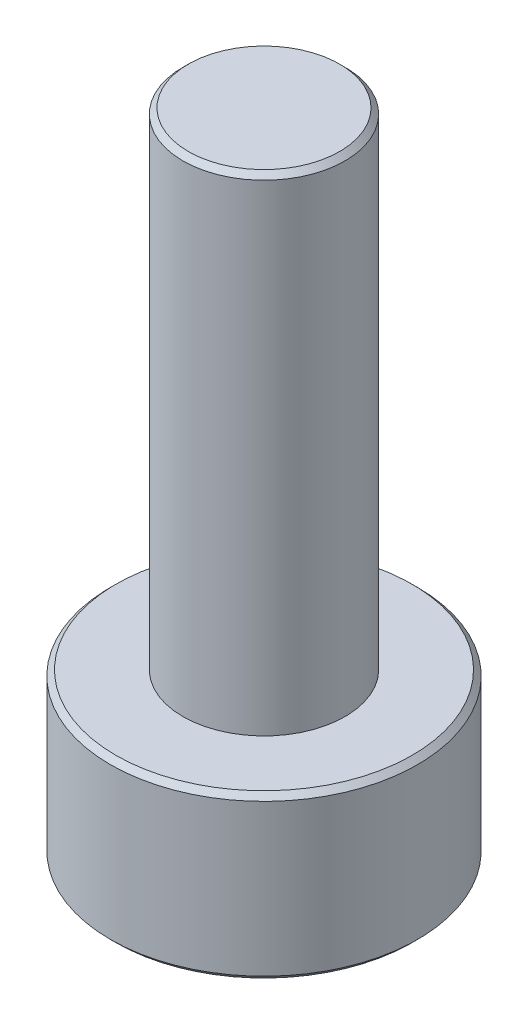
ISO-10303-21;
HEADER;
FILE_DESCRIPTION(('STEP AP214'),'2;1');
FILE_NAME('part.step','',(''),(''),'','','');
FILE_SCHEMA(('AUTOMOTIVE_DESIGN { 1 0 10303 214 1 1 1 1 }'));
ENDSEC;
DATA;
#1=APPLICATION_CONTEXT('core data for automotive mechanical design processes');
#2=APPLICATION_PROTOCOL_DEFINITION('international standard','automotive_design',2000,#1);
#3=PRODUCT_CONTEXT('',#1,'mechanical');
#4=PRODUCT('Part','Part','',(#3));
#5=PRODUCT_RELATED_PRODUCT_CATEGORY('part','',(#4));
#6=PRODUCT_DEFINITION_FORMATION('','',#4);
#7=PRODUCT_DEFINITION_CONTEXT('part definition',#1,'design');
#8=PRODUCT_DEFINITION('design','',#6,#7);
#9=PRODUCT_DEFINITION_SHAPE('','',#8);
#10=(LENGTH_UNIT() NAMED_UNIT(*) SI_UNIT(.MILLI.,.METRE.));
#11=(NAMED_UNIT(*) PLANE_ANGLE_UNIT() SI_UNIT($,.RADIAN.));
#12=(NAMED_UNIT(*) SI_UNIT($,.STERADIAN.) SOLID_ANGLE_UNIT());
#13=UNCERTAINTY_MEASURE_WITH_UNIT(LENGTH_MEASURE(1.E-05),#10,'distance_accuracy_value','');
#14=(GEOMETRIC_REPRESENTATION_CONTEXT(3) GLOBAL_UNCERTAINTY_ASSIGNED_CONTEXT((#13)) GLOBAL_UNIT_ASSIGNED_CONTEXT((#10,
#11,#12)) REPRESENTATION_CONTEXT('',''));
#15=CARTESIAN_POINT('',(0.,0.,0.));
#16=DIRECTION('',(0.,0.,1.));
#17=DIRECTION('',(1.,0.,0.));
#18=AXIS2_PLACEMENT_3D('',#15,#16,#17);
#19=CARTESIAN_POINT('',(0.,3.,0.));
#20=DIRECTION('',(0.,-1.,0.));
#21=DIRECTION('',(0.,0.,-1.));
#22=AXIS2_PLACEMENT_3D('',#19,#20,#21);
#23=CYLINDRICAL_SURFACE('',#22,2.84);
#24=CARTESIAN_POINT('',(0.,2.9,0.));
#25=DIRECTION('',(0.,1.,0.));
#26=DIRECTION('',(0.,0.,1.));
#27=AXIS2_PLACEMENT_3D('',#24,#25,#26);
#28=CIRCLE('',#27,2.84);
#29=CARTESIAN_POINT('',(0.,2.9,2.84));
#30=VERTEX_POINT('',#29);
#31=EDGE_CURVE('E43',#30,#30,#28,.F.);
#32=ORIENTED_EDGE('',*,*,#31,.T.);
#33=EDGE_LOOP('',(#32));
#34=FACE_BOUND('',#33,.T.);
#35=CARTESIAN_POINT('',(0.,0.100000000000002,0.));
#36=DIRECTION('',(0.,1.,0.));
#37=DIRECTION('',(0.,0.,1.));
#38=AXIS2_PLACEMENT_3D('',#35,#36,#37);
#39=CIRCLE('',#38,2.84);
#40=CARTESIAN_POINT('',(0.,0.100000000000002,2.84));
#41=VERTEX_POINT('',#40);
#42=EDGE_CURVE('E154',#41,#41,#39,.T.);
#43=ORIENTED_EDGE('',*,*,#42,.T.);
#44=EDGE_LOOP('',(#43));
#45=FACE_BOUND('',#44,.T.);
#46=ADVANCED_FACE('F35',(#34,#45),#23,.T.);
#47=CARTESIAN_POINT('',(0.,3.,0.));
#48=DIRECTION('',(0.,1.,0.));
#49=DIRECTION('',(0.,0.,1.));
#50=AXIS2_PLACEMENT_3D('',#47,#48,#49);
#51=PLANE('',#50);
#52=CARTESIAN_POINT('',(0.,3.,0.));
#53=DIRECTION('',(0.,1.,0.));
#54=DIRECTION('',(0.,0.,1.));
#55=AXIS2_PLACEMENT_3D('',#52,#53,#54);
#56=CIRCLE('',#55,2.74);
#57=CARTESIAN_POINT('',(0.,3.,2.74));
#58=VERTEX_POINT('',#57);
#59=EDGE_CURVE('E151',#58,#58,#56,.T.);
#60=ORIENTED_EDGE('',*,*,#59,.T.);
#61=EDGE_LOOP('',(#60));
#62=FACE_BOUND('',#61,.T.);
#63=CARTESIAN_POINT('',(0.,3.,0.));
#64=DIRECTION('',(0.,1.,0.));
#65=DIRECTION('',(0.,0.,1.));
#66=AXIS2_PLACEMENT_3D('',#63,#64,#65);
#67=CIRCLE('',#66,1.5);
#68=CARTESIAN_POINT('',(0.,3.,1.5));
#69=VERTEX_POINT('',#68);
#70=EDGE_CURVE('E137',#69,#69,#67,.T.);
#71=ORIENTED_EDGE('',*,*,#70,.F.);
#72=EDGE_LOOP('',(#71));
#73=FACE_BOUND('',#72,.T.);
#74=ADVANCED_FACE('F167',(#62,#73),#51,.T.);
#75=CARTESIAN_POINT('',(0.,0.,0.));
#76=DIRECTION('',(0.,1.,0.));
#77=DIRECTION('',(0.,0.,1.));
#78=AXIS2_PLACEMENT_3D('',#75,#76,#77);
#79=PLANE('',#78);
#80=CARTESIAN_POINT('',(0.,0.,0.));
#81=DIRECTION('',(0.,1.,0.));
#82=DIRECTION('',(0.,0.,1.));
#83=AXIS2_PLACEMENT_3D('',#80,#81,#82);
#84=CIRCLE('',#83,2.74);
#85=CARTESIAN_POINT('',(0.,0.,2.74));
#86=VERTEX_POINT('',#85);
#87=EDGE_CURVE('E11',#86,#86,#84,.F.);
#88=ORIENTED_EDGE('',*,*,#87,.T.);
#89=EDGE_LOOP('',(#88));
#90=FACE_BOUND('',#89,.T.);
#91=DIRECTION('',(0.,0.,1.));
#92=VECTOR('',#91,1.);
#93=CARTESIAN_POINT('',(1.29,0.,-0.744781847254618));
#94=LINE('',#93,#92);
#95=CARTESIAN_POINT('',(1.29,0.,-0.744781847254618));
#96=VERTEX_POINT('',#95);
#97=CARTESIAN_POINT('',(1.29,0.,0.744781847254619));
#98=VERTEX_POINT('',#97);
#99=EDGE_CURVE('E124',#96,#98,#94,.T.);
#100=ORIENTED_EDGE('',*,*,#99,.F.);
#101=DIRECTION('',(0.866025403784439,0.,0.5));
#102=VECTOR('',#101,1.);
#103=CARTESIAN_POINT('',(0.,0.,-1.48956369450924));
#104=LINE('',#103,#102);
#105=CARTESIAN_POINT('',(0.,0.,-1.48956369450924));
#106=VERTEX_POINT('',#105);
#107=EDGE_CURVE('E50',#106,#96,#104,.T.);
#108=ORIENTED_EDGE('',*,*,#107,.F.);
#109=DIRECTION('',(0.866025403784439,0.,-0.5));
#110=VECTOR('',#109,1.);
#111=CARTESIAN_POINT('',(-1.29,0.,-0.744781847254618));
#112=LINE('',#111,#110);
#113=CARTESIAN_POINT('',(-1.29,0.,-0.744781847254618));
#114=VERTEX_POINT('',#113);
#115=EDGE_CURVE('E133',#114,#106,#112,.T.);
#116=ORIENTED_EDGE('',*,*,#115,.F.);
#117=DIRECTION('',(0.,0.,-1.));
#118=VECTOR('',#117,1.);
#119=CARTESIAN_POINT('',(-1.29,0.,0.744781847254619));
#120=LINE('',#119,#118);
#121=CARTESIAN_POINT('',(-1.29,0.,0.744781847254619));
#122=VERTEX_POINT('',#121);
#123=EDGE_CURVE('E131',#122,#114,#120,.T.);
#124=ORIENTED_EDGE('',*,*,#123,.F.);
#125=DIRECTION('',(-0.866025403784439,0.,-0.5));
#126=VECTOR('',#125,1.);
#127=CARTESIAN_POINT('',(0.,0.,1.48956369450924));
#128=LINE('',#127,#126);
#129=CARTESIAN_POINT('',(0.,0.,1.48956369450924));
#130=VERTEX_POINT('',#129);
#131=EDGE_CURVE('E98',#130,#122,#128,.T.);
#132=ORIENTED_EDGE('',*,*,#131,.F.);
#133=DIRECTION('',(-0.866025403784439,0.,0.5));
#134=VECTOR('',#133,1.);
#135=CARTESIAN_POINT('',(1.29,0.,0.744781847254619));
#136=LINE('',#135,#134);
#137=EDGE_CURVE('E127',#98,#130,#136,.T.);
#138=ORIENTED_EDGE('',*,*,#137,.F.);
#139=EDGE_LOOP('',(#100,#108,#116,#124,#132,#138));
#140=FACE_BOUND('',#139,.T.);
#141=ADVANCED_FACE('F170',(#90,#140),#79,.F.);
#142=CARTESIAN_POINT('',(0.,12.,0.));
#143=DIRECTION('',(0.,-1.,0.));
#144=DIRECTION('',(0.,0.,-1.));
#145=AXIS2_PLACEMENT_3D('',#142,#143,#144);
#146=CYLINDRICAL_SURFACE('',#145,1.5);
#147=CARTESIAN_POINT('',(0.,11.9,0.));
#148=DIRECTION('',(0.,1.,0.));
#149=DIRECTION('',(0.,0.,1.));
#150=AXIS2_PLACEMENT_3D('',#147,#148,#149);
#151=CIRCLE('',#150,1.5);
#152=CARTESIAN_POINT('',(0.,11.9,1.5));
#153=VERTEX_POINT('',#152);
#154=EDGE_CURVE('E148',#153,#153,#151,.F.);
#155=ORIENTED_EDGE('',*,*,#154,.T.);
#156=EDGE_LOOP('',(#155));
#157=FACE_BOUND('',#156,.T.);
#158=ORIENTED_EDGE('',*,*,#70,.T.);
#159=EDGE_LOOP('',(#158));
#160=FACE_BOUND('',#159,.T.);
#161=ADVANCED_FACE('F174',(#157,#160),#146,.T.);
#162=CARTESIAN_POINT('',(0.,12.,0.));
#163=DIRECTION('',(0.,1.,0.));
#164=DIRECTION('',(0.,0.,1.));
#165=AXIS2_PLACEMENT_3D('',#162,#163,#164);
#166=PLANE('',#165);
#167=CARTESIAN_POINT('',(0.,12.,0.));
#168=DIRECTION('',(0.,1.,0.));
#169=DIRECTION('',(0.,0.,1.));
#170=AXIS2_PLACEMENT_3D('',#167,#168,#169);
#171=CIRCLE('',#170,1.4);
#172=CARTESIAN_POINT('',(0.,12.,1.4));
#173=VERTEX_POINT('',#172);
#174=EDGE_CURVE('E145',#173,#173,#171,.T.);
#175=ORIENTED_EDGE('',*,*,#174,.T.);
#176=EDGE_LOOP('',(#175));
#177=FACE_BOUND('',#176,.T.);
#178=ADVANCED_FACE('F176',(#177),#166,.T.);
#179=CARTESIAN_POINT('',(0.,1.3,-1.48956369450924));
#180=DIRECTION('',(0.5,0.,-0.866025403784439));
#181=DIRECTION('',(-0.866025403784439,0.,-0.5));
#182=AXIS2_PLACEMENT_3D('',#179,#180,#181);
#183=PLANE('',#182);
#184=ORIENTED_EDGE('',*,*,#107,.T.);
#185=DIRECTION('',(0.,-1.,0.));
#186=VECTOR('',#185,1.);
#187=CARTESIAN_POINT('',(1.29,1.3,-0.744781847254618));
#188=LINE('',#187,#186);
#189=CARTESIAN_POINT('',(1.29,1.3,-0.744781847254618));
#190=VERTEX_POINT('',#189);
#191=EDGE_CURVE('E80',#190,#96,#188,.T.);
#192=ORIENTED_EDGE('',*,*,#191,.F.);
#193=DIRECTION('',(0.866025403784439,0.,0.5));
#194=VECTOR('',#193,1.);
#195=CARTESIAN_POINT('',(0.,1.3,-1.48956369450924));
#196=LINE('',#195,#194);
#197=CARTESIAN_POINT('',(0.,1.3,-1.48956369450924));
#198=VERTEX_POINT('',#197);
#199=EDGE_CURVE('E135',#198,#190,#196,.T.);
#200=ORIENTED_EDGE('',*,*,#199,.F.);
#201=DIRECTION('',(0.,-1.,0.));
#202=VECTOR('',#201,1.);
#203=CARTESIAN_POINT('',(0.,1.3,-1.48956369450924));
#204=LINE('',#203,#202);
#205=EDGE_CURVE('E58',#198,#106,#204,.T.);
#206=ORIENTED_EDGE('',*,*,#205,.T.);
#207=EDGE_LOOP('',(#184,#192,#200,#206));
#208=FACE_BOUND('',#207,.T.);
#209=ADVANCED_FACE('F183',(#208),#183,.F.);
#210=CARTESIAN_POINT('',(-1.29,1.3,-0.744781847254618));
#211=DIRECTION('',(-0.5,0.,-0.866025403784439));
#212=DIRECTION('',(-0.866025403784439,0.,0.5));
#213=AXIS2_PLACEMENT_3D('',#210,#211,#212);
#214=PLANE('',#213);
#215=ORIENTED_EDGE('',*,*,#115,.T.);
#216=ORIENTED_EDGE('',*,*,#205,.F.);
#217=DIRECTION('',(0.866025403784439,0.,-0.5));
#218=VECTOR('',#217,1.);
#219=CARTESIAN_POINT('',(-1.29,1.3,-0.744781847254618));
#220=LINE('',#219,#218);
#221=CARTESIAN_POINT('',(-1.29,1.3,-0.744781847254618));
#222=VERTEX_POINT('',#221);
#223=EDGE_CURVE('E110',#222,#198,#220,.T.);
#224=ORIENTED_EDGE('',*,*,#223,.F.);
#225=DIRECTION('',(0.,-1.,0.));
#226=VECTOR('',#225,1.);
#227=CARTESIAN_POINT('',(-1.29,1.3,-0.744781847254618));
#228=LINE('',#227,#226);
#229=EDGE_CURVE('E102',#222,#114,#228,.T.);
#230=ORIENTED_EDGE('',*,*,#229,.T.);
#231=EDGE_LOOP('',(#215,#216,#224,#230));
#232=FACE_BOUND('',#231,.T.);
#233=ADVANCED_FACE('F210',(#232),#214,.F.);
#234=CARTESIAN_POINT('',(-1.29,1.3,0.744781847254619));
#235=DIRECTION('',(-1.,0.,0.));
#236=DIRECTION('',(0.,0.,1.));
#237=AXIS2_PLACEMENT_3D('',#234,#235,#236);
#238=PLANE('',#237);
#239=ORIENTED_EDGE('',*,*,#123,.T.);
#240=ORIENTED_EDGE('',*,*,#229,.F.);
#241=DIRECTION('',(0.,0.,-1.));
#242=VECTOR('',#241,1.);
#243=CARTESIAN_POINT('',(-1.29,1.3,0.744781847254619));
#244=LINE('',#243,#242);
#245=CARTESIAN_POINT('',(-1.29,1.3,0.744781847254619));
#246=VERTEX_POINT('',#245);
#247=EDGE_CURVE('E106',#246,#222,#244,.T.);
#248=ORIENTED_EDGE('',*,*,#247,.F.);
#249=DIRECTION('',(0.,-1.,0.));
#250=VECTOR('',#249,1.);
#251=CARTESIAN_POINT('',(-1.29,1.3,0.744781847254619));
#252=LINE('',#251,#250);
#253=EDGE_CURVE('E91',#246,#122,#252,.T.);
#254=ORIENTED_EDGE('',*,*,#253,.T.);
#255=EDGE_LOOP('',(#239,#240,#248,#254));
#256=FACE_BOUND('',#255,.T.);
#257=ADVANCED_FACE('F107',(#256),#238,.F.);
#258=CARTESIAN_POINT('',(0.,1.3,1.48956369450924));
#259=DIRECTION('',(-0.5,0.,0.866025403784439));
#260=DIRECTION('',(0.866025403784439,0.,0.5));
#261=AXIS2_PLACEMENT_3D('',#258,#259,#260);
#262=PLANE('',#261);
#263=ORIENTED_EDGE('',*,*,#131,.T.);
#264=ORIENTED_EDGE('',*,*,#253,.F.);
#265=DIRECTION('',(-0.866025403784439,0.,-0.5));
#266=VECTOR('',#265,1.);
#267=CARTESIAN_POINT('',(0.,1.3,1.48956369450924));
#268=LINE('',#267,#266);
#269=CARTESIAN_POINT('',(0.,1.3,1.48956369450924));
#270=VERTEX_POINT('',#269);
#271=EDGE_CURVE('E95',#270,#246,#268,.T.);
#272=ORIENTED_EDGE('',*,*,#271,.F.);
#273=DIRECTION('',(0.,-1.,0.));
#274=VECTOR('',#273,1.);
#275=CARTESIAN_POINT('',(0.,1.3,1.48956369450924));
#276=LINE('',#275,#274);
#277=EDGE_CURVE('E103',#270,#130,#276,.T.);
#278=ORIENTED_EDGE('',*,*,#277,.T.);
#279=EDGE_LOOP('',(#263,#264,#272,#278));
#280=FACE_BOUND('',#279,.T.);
#281=ADVANCED_FACE('F93',(#280),#262,.F.);
#282=CARTESIAN_POINT('',(1.29,1.3,0.744781847254619));
#283=DIRECTION('',(0.5,0.,0.866025403784439));
#284=DIRECTION('',(0.866025403784439,0.,-0.5));
#285=AXIS2_PLACEMENT_3D('',#282,#283,#284);
#286=PLANE('',#285);
#287=ORIENTED_EDGE('',*,*,#137,.T.);
#288=ORIENTED_EDGE('',*,*,#277,.F.);
#289=DIRECTION('',(-0.866025403784439,0.,0.5));
#290=VECTOR('',#289,1.);
#291=CARTESIAN_POINT('',(1.29,1.3,0.744781847254619));
#292=LINE('',#291,#290);
#293=CARTESIAN_POINT('',(1.29,1.3,0.744781847254619));
#294=VERTEX_POINT('',#293);
#295=EDGE_CURVE('E116',#294,#270,#292,.T.);
#296=ORIENTED_EDGE('',*,*,#295,.F.);
#297=DIRECTION('',(0.,-1.,0.));
#298=VECTOR('',#297,1.);
#299=CARTESIAN_POINT('',(1.29,1.3,0.744781847254619));
#300=LINE('',#299,#298);
#301=EDGE_CURVE('E140',#294,#98,#300,.T.);
#302=ORIENTED_EDGE('',*,*,#301,.T.);
#303=EDGE_LOOP('',(#287,#288,#296,#302));
#304=FACE_BOUND('',#303,.T.);
#305=ADVANCED_FACE('F206',(#304),#286,.F.);
#306=CARTESIAN_POINT('',(1.29,1.3,-0.744781847254618));
#307=DIRECTION('',(1.,0.,0.));
#308=DIRECTION('',(0.,0.,-1.));
#309=AXIS2_PLACEMENT_3D('',#306,#307,#308);
#310=PLANE('',#309);
#311=ORIENTED_EDGE('',*,*,#99,.T.);
#312=ORIENTED_EDGE('',*,*,#301,.F.);
#313=DIRECTION('',(0.,0.,1.));
#314=VECTOR('',#313,1.);
#315=CARTESIAN_POINT('',(1.29,1.3,-0.744781847254618));
#316=LINE('',#315,#314);
#317=EDGE_CURVE('E118',#190,#294,#316,.T.);
#318=ORIENTED_EDGE('',*,*,#317,.F.);
#319=ORIENTED_EDGE('',*,*,#191,.T.);
#320=EDGE_LOOP('',(#311,#312,#318,#319));
#321=FACE_BOUND('',#320,.T.);
#322=ADVANCED_FACE('F198',(#321),#310,.F.);
#323=CARTESIAN_POINT('',(0.,1.3,0.));
#324=DIRECTION('',(0.,-1.,0.));
#325=DIRECTION('',(0.,0.,-1.));
#326=AXIS2_PLACEMENT_3D('',#323,#324,#325);
#327=PLANE('',#326);
#328=ORIENTED_EDGE('',*,*,#199,.T.);
#329=ORIENTED_EDGE('',*,*,#317,.T.);
#330=ORIENTED_EDGE('',*,*,#295,.T.);
#331=ORIENTED_EDGE('',*,*,#271,.T.);
#332=ORIENTED_EDGE('',*,*,#247,.T.);
#333=ORIENTED_EDGE('',*,*,#223,.T.);
#334=EDGE_LOOP('',(#328,#329,#330,#331,#332,#333));
#335=FACE_BOUND('',#334,.T.);
#336=ADVANCED_FACE('F113',(#335),#327,.T.);
#337=CARTESIAN_POINT('',(0.,12.,0.));
#338=DIRECTION('',(0.,-1.,0.));
#339=DIRECTION('',(0.,0.,-1.));
#340=AXIS2_PLACEMENT_3D('',#337,#338,#339);
#341=CONICAL_SURFACE('',#340,1.4,0.785398163397453);
#342=ORIENTED_EDGE('',*,*,#154,.F.);
#343=EDGE_LOOP('',(#342));
#344=FACE_BOUND('',#343,.T.);
#345=ORIENTED_EDGE('',*,*,#174,.F.);
#346=EDGE_LOOP('',(#345));
#347=FACE_BOUND('',#346,.T.);
#348=ADVANCED_FACE('F164',(#344,#347),#341,.T.);
#349=CARTESIAN_POINT('',(0.,3.,0.));
#350=DIRECTION('',(0.,-1.,0.));
#351=DIRECTION('',(0.,0.,-1.));
#352=AXIS2_PLACEMENT_3D('',#349,#350,#351);
#353=CONICAL_SURFACE('',#352,2.74,0.78539816339744);
#354=ORIENTED_EDGE('',*,*,#31,.F.);
#355=EDGE_LOOP('',(#354));
#356=FACE_BOUND('',#355,.T.);
#357=ORIENTED_EDGE('',*,*,#59,.F.);
#358=EDGE_LOOP('',(#357));
#359=FACE_BOUND('',#358,.T.);
#360=ADVANCED_FACE('F161',(#356,#359),#353,.T.);
#361=CARTESIAN_POINT('',(0.,0.100000000000002,0.));
#362=DIRECTION('',(0.,1.,0.));
#363=DIRECTION('',(0.,0.,1.));
#364=AXIS2_PLACEMENT_3D('',#361,#362,#363);
#365=CONICAL_SURFACE('',#364,2.84,0.785398163397442);
#366=ORIENTED_EDGE('',*,*,#87,.F.);
#367=EDGE_LOOP('',(#366));
#368=FACE_BOUND('',#367,.T.);
#369=ORIENTED_EDGE('',*,*,#42,.F.);
#370=EDGE_LOOP('',(#369));
#371=FACE_BOUND('',#370,.T.);
#372=ADVANCED_FACE('F37',(#368,#371),#365,.T.);
#373=CLOSED_SHELL('',(#46,#74,#141,#161,#178,#209,#233,#257,#281,#305,#322,#336,#348,#360,#372));
#374=MANIFOLD_SOLID_BREP('B2',#373);
#375=ADVANCED_BREP_SHAPE_REPRESENTATION('',(#18,#374),#14);
#376=SHAPE_DEFINITION_REPRESENTATION(#9,#375);
ENDSEC;
END-ISO-10303-21;
